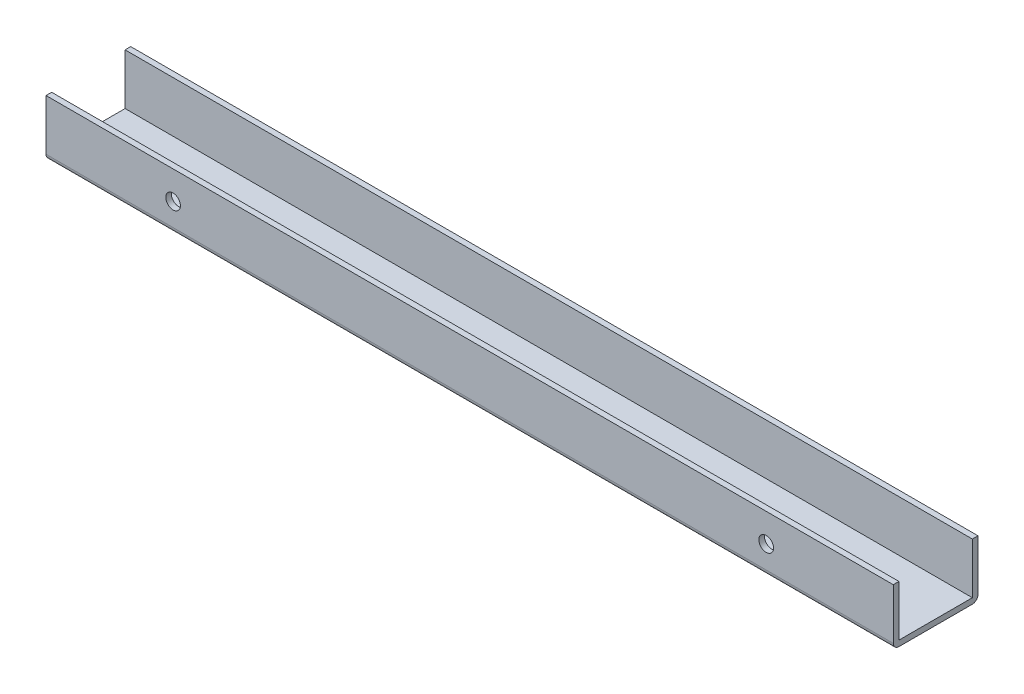
ISO-10303-21;
HEADER;
FILE_DESCRIPTION(('STEP AP214'),'2;1');
FILE_NAME('part.step','',(''),(''),'','','');
FILE_SCHEMA(('AUTOMOTIVE_DESIGN { 1 0 10303 214 1 1 1 1 }'));
ENDSEC;
DATA;
#1=APPLICATION_CONTEXT('core data for automotive mechanical design processes');
#2=APPLICATION_PROTOCOL_DEFINITION('international standard','automotive_design',2000,#1);
#3=PRODUCT_CONTEXT('',#1,'mechanical');
#4=PRODUCT('Part','Part','',(#3));
#5=PRODUCT_RELATED_PRODUCT_CATEGORY('part','',(#4));
#6=PRODUCT_DEFINITION_FORMATION('','',#4);
#7=PRODUCT_DEFINITION_CONTEXT('part definition',#1,'design');
#8=PRODUCT_DEFINITION('design','',#6,#7);
#9=PRODUCT_DEFINITION_SHAPE('','',#8);
#10=(LENGTH_UNIT() NAMED_UNIT(*) SI_UNIT(.MILLI.,.METRE.));
#11=(NAMED_UNIT(*) PLANE_ANGLE_UNIT() SI_UNIT($,.RADIAN.));
#12=(NAMED_UNIT(*) SI_UNIT($,.STERADIAN.) SOLID_ANGLE_UNIT());
#13=UNCERTAINTY_MEASURE_WITH_UNIT(LENGTH_MEASURE(1.E-05),#10,'distance_accuracy_value','');
#14=(GEOMETRIC_REPRESENTATION_CONTEXT(3) GLOBAL_UNCERTAINTY_ASSIGNED_CONTEXT((#13)) GLOBAL_UNIT_ASSIGNED_CONTEXT((#10,
#11,#12)) REPRESENTATION_CONTEXT('',''));
#15=CARTESIAN_POINT('',(0.,0.,0.));
#16=DIRECTION('',(0.,0.,1.));
#17=DIRECTION('',(1.,0.,0.));
#18=AXIS2_PLACEMENT_3D('',#15,#16,#17);
#19=CARTESIAN_POINT('',(1500.,9.99999999999998,-10.));
#20=DIRECTION('',(0.,0.,1.));
#21=DIRECTION('',(0.,-1.,0.));
#22=AXIS2_PLACEMENT_3D('',#19,#20,#21);
#23=PLANE('',#22);
#24=CARTESIAN_POINT('',(1275.,49.9999999999999,-10.));
#25=DIRECTION('',(0.,0.,1.));
#26=DIRECTION('',(1.,0.,0.));
#27=AXIS2_PLACEMENT_3D('',#24,#25,#26);
#28=CIRCLE('',#27,12.9999999999998);
#29=CARTESIAN_POINT('',(1288.,49.9999999999999,-10.));
#30=VERTEX_POINT('',#29);
#31=EDGE_CURVE('E211',#30,#30,#28,.T.);
#32=ORIENTED_EDGE('',*,*,#31,.T.);
#33=EDGE_LOOP('',(#32));
#34=FACE_BOUND('',#33,.T.);
#35=CARTESIAN_POINT('',(225.,49.9999999999999,-10.));
#36=DIRECTION('',(0.,0.,1.));
#37=DIRECTION('',(1.,0.,0.));
#38=AXIS2_PLACEMENT_3D('',#35,#36,#37);
#39=CIRCLE('',#38,13.);
#40=CARTESIAN_POINT('',(238.,49.9999999999999,-10.));
#41=VERTEX_POINT('',#40);
#42=EDGE_CURVE('E146',#41,#41,#39,.T.);
#43=ORIENTED_EDGE('',*,*,#42,.T.);
#44=EDGE_LOOP('',(#43));
#45=FACE_BOUND('',#44,.T.);
#46=DIRECTION('',(0.,1.,0.));
#47=VECTOR('',#46,1.);
#48=CARTESIAN_POINT('',(0.,10.,-10.));
#49=LINE('',#48,#47);
#50=CARTESIAN_POINT('',(0.,10.,-10.));
#51=VERTEX_POINT('',#50);
#52=CARTESIAN_POINT('',(0.,100.,-10.0000000000001));
#53=VERTEX_POINT('',#52);
#54=EDGE_CURVE('E142',#51,#53,#49,.T.);
#55=ORIENTED_EDGE('',*,*,#54,.T.);
#56=DIRECTION('',(-1.,0.,0.));
#57=VECTOR('',#56,1.);
#58=CARTESIAN_POINT('',(1500.,100.,-10.0000000000001));
#59=LINE('',#58,#57);
#60=CARTESIAN_POINT('',(1500.,100.,-10.0000000000001));
#61=VERTEX_POINT('',#60);
#62=EDGE_CURVE('E11',#61,#53,#59,.T.);
#63=ORIENTED_EDGE('',*,*,#62,.F.);
#64=DIRECTION('',(0.,1.,0.));
#65=VECTOR('',#64,1.);
#66=CARTESIAN_POINT('',(1500.,9.99999999999998,-10.));
#67=LINE('',#66,#65);
#68=CARTESIAN_POINT('',(1500.,9.99999999999998,-10.));
#69=VERTEX_POINT('',#68);
#70=EDGE_CURVE('E161',#69,#61,#67,.T.);
#71=ORIENTED_EDGE('',*,*,#70,.F.);
#72=DIRECTION('',(-1.,0.,0.));
#73=VECTOR('',#72,1.);
#74=CARTESIAN_POINT('',(1500.,9.99999999999998,-10.));
#75=LINE('',#74,#73);
#76=EDGE_CURVE('E138',#69,#51,#75,.T.);
#77=ORIENTED_EDGE('',*,*,#76,.T.);
#78=EDGE_LOOP('',(#55,#63,#71,#77));
#79=FACE_BOUND('',#78,.T.);
#80=ADVANCED_FACE('F34',(#34,#45,#79),#23,.F.);
#81=CARTESIAN_POINT('',(1500.,100.,-1.11022302462516E-13));
#82=DIRECTION('',(0.,-1.,0.));
#83=DIRECTION('',(0.,0.,-1.));
#84=AXIS2_PLACEMENT_3D('',#81,#82,#83);
#85=PLANE('',#84);
#86=DIRECTION('',(0.,0.,1.));
#87=VECTOR('',#86,1.);
#88=CARTESIAN_POINT('',(0.,100.,-1.11022302462516E-13));
#89=LINE('',#88,#87);
#90=CARTESIAN_POINT('',(0.,100.,-1.11022302462516E-13));
#91=VERTEX_POINT('',#90);
#92=EDGE_CURVE('E145',#53,#91,#89,.T.);
#93=ORIENTED_EDGE('',*,*,#92,.T.);
#94=DIRECTION('',(-1.,0.,0.));
#95=VECTOR('',#94,1.);
#96=CARTESIAN_POINT('',(1500.,100.,-1.11022302462516E-13));
#97=LINE('',#96,#95);
#98=CARTESIAN_POINT('',(1500.,100.,-1.11022302462516E-13));
#99=VERTEX_POINT('',#98);
#100=EDGE_CURVE('E42',#99,#91,#97,.T.);
#101=ORIENTED_EDGE('',*,*,#100,.F.);
#102=DIRECTION('',(0.,0.,1.));
#103=VECTOR('',#102,1.);
#104=CARTESIAN_POINT('',(1500.,100.,-1.11022302462516E-13));
#105=LINE('',#104,#103);
#106=EDGE_CURVE('E99',#61,#99,#105,.T.);
#107=ORIENTED_EDGE('',*,*,#106,.F.);
#108=ORIENTED_EDGE('',*,*,#62,.T.);
#109=EDGE_LOOP('',(#93,#101,#107,#108));
#110=FACE_BOUND('',#109,.T.);
#111=ADVANCED_FACE('F231',(#110),#85,.F.);
#112=CARTESIAN_POINT('',(1500.,10.,0.));
#113=DIRECTION('',(0.,0.,-1.));
#114=DIRECTION('',(-1.,0.,0.));
#115=AXIS2_PLACEMENT_3D('',#112,#113,#114);
#116=PLANE('',#115);
#117=CARTESIAN_POINT('',(1275.,49.9999999999999,0.));
#118=DIRECTION('',(0.,0.,1.));
#119=DIRECTION('',(1.,0.,0.));
#120=AXIS2_PLACEMENT_3D('',#117,#118,#119);
#121=CIRCLE('',#120,12.9999999999998);
#122=CARTESIAN_POINT('',(1288.,49.9999999999999,0.));
#123=VERTEX_POINT('',#122);
#124=EDGE_CURVE('E214',#123,#123,#121,.T.);
#125=ORIENTED_EDGE('',*,*,#124,.F.);
#126=EDGE_LOOP('',(#125));
#127=FACE_BOUND('',#126,.T.);
#128=CARTESIAN_POINT('',(225.,49.9999999999999,0.));
#129=DIRECTION('',(0.,0.,1.));
#130=DIRECTION('',(1.,0.,0.));
#131=AXIS2_PLACEMENT_3D('',#128,#129,#130);
#132=CIRCLE('',#131,13.);
#133=CARTESIAN_POINT('',(238.,49.9999999999999,0.));
#134=VERTEX_POINT('',#133);
#135=EDGE_CURVE('E208',#134,#134,#132,.T.);
#136=ORIENTED_EDGE('',*,*,#135,.F.);
#137=EDGE_LOOP('',(#136));
#138=FACE_BOUND('',#137,.T.);
#139=DIRECTION('',(0.,-1.,0.));
#140=VECTOR('',#139,1.);
#141=CARTESIAN_POINT('',(0.,10.0000000000001,0.));
#142=LINE('',#141,#140);
#143=CARTESIAN_POINT('',(0.,10.0000000000001,0.));
#144=VERTEX_POINT('',#143);
#145=EDGE_CURVE('E148',#91,#144,#142,.T.);
#146=ORIENTED_EDGE('',*,*,#145,.T.);
#147=DIRECTION('',(-1.,0.,0.));
#148=VECTOR('',#147,1.);
#149=CARTESIAN_POINT('',(1500.,10.,0.));
#150=LINE('',#149,#148);
#151=CARTESIAN_POINT('',(1500.,10.,0.));
#152=VERTEX_POINT('',#151);
#153=EDGE_CURVE('E174',#152,#144,#150,.T.);
#154=ORIENTED_EDGE('',*,*,#153,.F.);
#155=DIRECTION('',(0.,-1.,0.));
#156=VECTOR('',#155,1.);
#157=CARTESIAN_POINT('',(1500.,10.,0.));
#158=LINE('',#157,#156);
#159=EDGE_CURVE('E182',#99,#152,#158,.T.);
#160=ORIENTED_EDGE('',*,*,#159,.F.);
#161=ORIENTED_EDGE('',*,*,#100,.T.);
#162=EDGE_LOOP('',(#146,#154,#160,#161));
#163=FACE_BOUND('',#162,.T.);
#164=ADVANCED_FACE('F180',(#127,#138,#163),#116,.F.);
#165=CARTESIAN_POINT('',(1500.,9.99999999999998,-10.));
#166=DIRECTION('',(-1.,0.,0.));
#167=DIRECTION('',(0.,0.,1.));
#168=AXIS2_PLACEMENT_3D('',#165,#166,#167);
#169=CYLINDRICAL_SURFACE('',#168,10.);
#170=CARTESIAN_POINT('',(0.,10.,-10.));
#171=DIRECTION('',(1.,0.,0.));
#172=DIRECTION('',(0.,0.,1.));
#173=AXIS2_PLACEMENT_3D('',#170,#171,#172);
#174=CIRCLE('',#173,10.);
#175=CARTESIAN_POINT('',(0.,0.,-10.0000000000001));
#176=VERTEX_POINT('',#175);
#177=EDGE_CURVE('E150',#144,#176,#174,.T.);
#178=ORIENTED_EDGE('',*,*,#177,.T.);
#179=DIRECTION('',(-1.,0.,0.));
#180=VECTOR('',#179,1.);
#181=CARTESIAN_POINT('',(1500.,-1.11022302462516E-13,-10.0000000000001));
#182=LINE('',#181,#180);
#183=CARTESIAN_POINT('',(1500.,-1.11022302462516E-13,-10.0000000000001));
#184=VERTEX_POINT('',#183);
#185=EDGE_CURVE('E171',#184,#176,#182,.T.);
#186=ORIENTED_EDGE('',*,*,#185,.F.);
#187=CARTESIAN_POINT('',(1500.,9.99999999999998,-10.));
#188=DIRECTION('',(1.,0.,0.));
#189=DIRECTION('',(0.,0.,1.));
#190=AXIS2_PLACEMENT_3D('',#187,#188,#189);
#191=CIRCLE('',#190,10.);
#192=EDGE_CURVE('E200',#152,#184,#191,.T.);
#193=ORIENTED_EDGE('',*,*,#192,.F.);
#194=ORIENTED_EDGE('',*,*,#153,.T.);
#195=EDGE_LOOP('',(#178,#186,#193,#194));
#196=FACE_BOUND('',#195,.T.);
#197=ADVANCED_FACE('F191',(#196),#169,.T.);
#198=CARTESIAN_POINT('',(1500.,-1.11022302462516E-13,-10.0000000000001));
#199=DIRECTION('',(0.,1.,0.));
#200=DIRECTION('',(0.,0.,1.));
#201=AXIS2_PLACEMENT_3D('',#198,#199,#200);
#202=PLANE('',#201);
#203=DIRECTION('',(0.,0.,-1.));
#204=VECTOR('',#203,1.);
#205=CARTESIAN_POINT('',(0.,0.,-10.0000000000001));
#206=LINE('',#205,#204);
#207=CARTESIAN_POINT('',(0.,-1.11022302462516E-13,-140.));
#208=VERTEX_POINT('',#207);
#209=EDGE_CURVE('E152',#176,#208,#206,.T.);
#210=ORIENTED_EDGE('',*,*,#209,.T.);
#211=DIRECTION('',(-1.,0.,0.));
#212=VECTOR('',#211,1.);
#213=CARTESIAN_POINT('',(1500.,0.,-140.));
#214=LINE('',#213,#212);
#215=CARTESIAN_POINT('',(1500.,0.,-140.));
#216=VERTEX_POINT('',#215);
#217=EDGE_CURVE('E168',#216,#208,#214,.T.);
#218=ORIENTED_EDGE('',*,*,#217,.F.);
#219=DIRECTION('',(0.,0.,-1.));
#220=VECTOR('',#219,1.);
#221=CARTESIAN_POINT('',(1500.,-1.11022302462516E-13,-10.0000000000001));
#222=LINE('',#221,#220);
#223=EDGE_CURVE('E197',#184,#216,#222,.T.);
#224=ORIENTED_EDGE('',*,*,#223,.F.);
#225=ORIENTED_EDGE('',*,*,#185,.T.);
#226=EDGE_LOOP('',(#210,#218,#224,#225));
#227=FACE_BOUND('',#226,.T.);
#228=ADVANCED_FACE('F195',(#227),#202,.F.);
#229=CARTESIAN_POINT('',(1500.,9.99999999999998,-140.));
#230=DIRECTION('',(-1.,0.,0.));
#231=DIRECTION('',(0.,0.,1.));
#232=AXIS2_PLACEMENT_3D('',#229,#230,#231);
#233=CYLINDRICAL_SURFACE('',#232,10.);
#234=CARTESIAN_POINT('',(0.,9.9999999999999,-140.));
#235=DIRECTION('',(1.,0.,0.));
#236=DIRECTION('',(0.,0.,-1.));
#237=AXIS2_PLACEMENT_3D('',#234,#235,#236);
#238=CIRCLE('',#237,10.);
#239=CARTESIAN_POINT('',(0.,9.99999999999998,-150.));
#240=VERTEX_POINT('',#239);
#241=EDGE_CURVE('E154',#208,#240,#238,.T.);
#242=ORIENTED_EDGE('',*,*,#241,.T.);
#243=DIRECTION('',(-1.,0.,0.));
#244=VECTOR('',#243,1.);
#245=CARTESIAN_POINT('',(1500.,10.0000000000001,-150.));
#246=LINE('',#245,#244);
#247=CARTESIAN_POINT('',(1500.,10.0000000000001,-150.));
#248=VERTEX_POINT('',#247);
#249=EDGE_CURVE('E165',#248,#240,#246,.T.);
#250=ORIENTED_EDGE('',*,*,#249,.F.);
#251=CARTESIAN_POINT('',(1500.,9.99999999999998,-140.));
#252=DIRECTION('',(1.,0.,0.));
#253=DIRECTION('',(0.,0.,-1.));
#254=AXIS2_PLACEMENT_3D('',#251,#252,#253);
#255=CIRCLE('',#254,10.);
#256=EDGE_CURVE('E199',#216,#248,#255,.T.);
#257=ORIENTED_EDGE('',*,*,#256,.F.);
#258=ORIENTED_EDGE('',*,*,#217,.T.);
#259=EDGE_LOOP('',(#242,#250,#257,#258));
#260=FACE_BOUND('',#259,.T.);
#261=ADVANCED_FACE('F255',(#260),#233,.T.);
#262=CARTESIAN_POINT('',(1500.,10.0000000000001,-150.));
#263=DIRECTION('',(0.,0.,1.));
#264=DIRECTION('',(1.,0.,0.));
#265=AXIS2_PLACEMENT_3D('',#262,#263,#264);
#266=PLANE('',#265);
#267=DIRECTION('',(0.,1.,0.));
#268=VECTOR('',#267,1.);
#269=CARTESIAN_POINT('',(0.,9.99999999999998,-150.));
#270=LINE('',#269,#268);
#271=CARTESIAN_POINT('',(0.,100.,-150.));
#272=VERTEX_POINT('',#271);
#273=EDGE_CURVE('E156',#240,#272,#270,.T.);
#274=ORIENTED_EDGE('',*,*,#273,.T.);
#275=DIRECTION('',(-1.,0.,0.));
#276=VECTOR('',#275,1.);
#277=CARTESIAN_POINT('',(1500.,99.9999999999999,-150.));
#278=LINE('',#277,#276);
#279=CARTESIAN_POINT('',(1500.,99.9999999999999,-150.));
#280=VERTEX_POINT('',#279);
#281=EDGE_CURVE('E133',#280,#272,#278,.T.);
#282=ORIENTED_EDGE('',*,*,#281,.F.);
#283=DIRECTION('',(0.,1.,0.));
#284=VECTOR('',#283,1.);
#285=CARTESIAN_POINT('',(1500.,10.0000000000001,-150.));
#286=LINE('',#285,#284);
#287=EDGE_CURVE('E124',#248,#280,#286,.T.);
#288=ORIENTED_EDGE('',*,*,#287,.F.);
#289=ORIENTED_EDGE('',*,*,#249,.T.);
#290=EDGE_LOOP('',(#274,#282,#288,#289));
#291=FACE_BOUND('',#290,.T.);
#292=ADVANCED_FACE('F258',(#291),#266,.F.);
#293=CARTESIAN_POINT('',(1500.,99.9999999999999,-140.));
#294=DIRECTION('',(0.,-1.,0.));
#295=DIRECTION('',(0.,0.,-1.));
#296=AXIS2_PLACEMENT_3D('',#293,#294,#295);
#297=PLANE('',#296);
#298=DIRECTION('',(0.,0.,1.));
#299=VECTOR('',#298,1.);
#300=CARTESIAN_POINT('',(0.,100.,-140.));
#301=LINE('',#300,#299);
#302=CARTESIAN_POINT('',(0.,100.,-140.));
#303=VERTEX_POINT('',#302);
#304=EDGE_CURVE('E132',#272,#303,#301,.T.);
#305=ORIENTED_EDGE('',*,*,#304,.T.);
#306=DIRECTION('',(-1.,0.,0.));
#307=VECTOR('',#306,1.);
#308=CARTESIAN_POINT('',(1500.,99.9999999999999,-140.));
#309=LINE('',#308,#307);
#310=CARTESIAN_POINT('',(1500.,99.9999999999999,-140.));
#311=VERTEX_POINT('',#310);
#312=EDGE_CURVE('E129',#311,#303,#309,.T.);
#313=ORIENTED_EDGE('',*,*,#312,.F.);
#314=DIRECTION('',(0.,0.,1.));
#315=VECTOR('',#314,1.);
#316=CARTESIAN_POINT('',(1500.,99.9999999999999,-140.));
#317=LINE('',#316,#315);
#318=EDGE_CURVE('E118',#280,#311,#317,.T.);
#319=ORIENTED_EDGE('',*,*,#318,.F.);
#320=ORIENTED_EDGE('',*,*,#281,.T.);
#321=EDGE_LOOP('',(#305,#313,#319,#320));
#322=FACE_BOUND('',#321,.T.);
#323=ADVANCED_FACE('F130',(#322),#297,.F.);
#324=CARTESIAN_POINT('',(1500.,9.99999999999998,-140.));
#325=DIRECTION('',(0.,0.,-1.));
#326=DIRECTION('',(-1.,0.,0.));
#327=AXIS2_PLACEMENT_3D('',#324,#325,#326);
#328=PLANE('',#327);
#329=DIRECTION('',(0.,-1.,0.));
#330=VECTOR('',#329,1.);
#331=CARTESIAN_POINT('',(0.,9.9999999999999,-140.));
#332=LINE('',#331,#330);
#333=CARTESIAN_POINT('',(0.,9.9999999999999,-140.));
#334=VERTEX_POINT('',#333);
#335=EDGE_CURVE('E85',#303,#334,#332,.T.);
#336=ORIENTED_EDGE('',*,*,#335,.T.);
#337=DIRECTION('',(-1.,0.,0.));
#338=VECTOR('',#337,1.);
#339=CARTESIAN_POINT('',(1500.,9.99999999999998,-140.));
#340=LINE('',#339,#338);
#341=CARTESIAN_POINT('',(1500.,9.99999999999998,-140.));
#342=VERTEX_POINT('',#341);
#343=EDGE_CURVE('E134',#342,#334,#340,.T.);
#344=ORIENTED_EDGE('',*,*,#343,.F.);
#345=DIRECTION('',(0.,-1.,0.));
#346=VECTOR('',#345,1.);
#347=CARTESIAN_POINT('',(1500.,9.99999999999998,-140.));
#348=LINE('',#347,#346);
#349=EDGE_CURVE('E122',#311,#342,#348,.T.);
#350=ORIENTED_EDGE('',*,*,#349,.F.);
#351=ORIENTED_EDGE('',*,*,#312,.T.);
#352=EDGE_LOOP('',(#336,#344,#350,#351));
#353=FACE_BOUND('',#352,.T.);
#354=ADVANCED_FACE('F136',(#353),#328,.F.);
#355=CARTESIAN_POINT('',(1500.,9.99999999999998,-10.));
#356=DIRECTION('',(0.,-1.,0.));
#357=DIRECTION('',(0.,0.,-1.));
#358=AXIS2_PLACEMENT_3D('',#355,#356,#357);
#359=PLANE('',#358);
#360=DIRECTION('',(0.,0.,1.));
#361=VECTOR('',#360,1.);
#362=CARTESIAN_POINT('',(0.,10.,-10.));
#363=LINE('',#362,#361);
#364=EDGE_CURVE('E91',#334,#51,#363,.T.);
#365=ORIENTED_EDGE('',*,*,#364,.T.);
#366=ORIENTED_EDGE('',*,*,#76,.F.);
#367=DIRECTION('',(0.,0.,1.));
#368=VECTOR('',#367,1.);
#369=CARTESIAN_POINT('',(1500.,9.99999999999998,-10.));
#370=LINE('',#369,#368);
#371=EDGE_CURVE('E50',#342,#69,#370,.T.);
#372=ORIENTED_EDGE('',*,*,#371,.F.);
#373=ORIENTED_EDGE('',*,*,#343,.T.);
#374=EDGE_LOOP('',(#365,#366,#372,#373));
#375=FACE_BOUND('',#374,.T.);
#376=ADVANCED_FACE('F267',(#375),#359,.F.);
#377=CARTESIAN_POINT('',(1500.,9.99999999999998,-10.));
#378=DIRECTION('',(-1.,0.,0.));
#379=DIRECTION('',(0.,0.,1.));
#380=AXIS2_PLACEMENT_3D('',#377,#378,#379);
#381=PLANE('',#380);
#382=ORIENTED_EDGE('',*,*,#70,.T.);
#383=ORIENTED_EDGE('',*,*,#106,.T.);
#384=ORIENTED_EDGE('',*,*,#159,.T.);
#385=ORIENTED_EDGE('',*,*,#192,.T.);
#386=ORIENTED_EDGE('',*,*,#223,.T.);
#387=ORIENTED_EDGE('',*,*,#256,.T.);
#388=ORIENTED_EDGE('',*,*,#287,.T.);
#389=ORIENTED_EDGE('',*,*,#318,.T.);
#390=ORIENTED_EDGE('',*,*,#349,.T.);
#391=ORIENTED_EDGE('',*,*,#371,.T.);
#392=EDGE_LOOP('',(#382,#383,#384,#385,#386,#387,#388,#389,#390,#391));
#393=FACE_BOUND('',#392,.T.);
#394=ADVANCED_FACE('F120',(#393),#381,.F.);
#395=CARTESIAN_POINT('',(0.,10.,-10.));
#396=DIRECTION('',(-1.,0.,0.));
#397=DIRECTION('',(0.,0.,1.));
#398=AXIS2_PLACEMENT_3D('',#395,#396,#397);
#399=PLANE('',#398);
#400=ORIENTED_EDGE('',*,*,#54,.F.);
#401=ORIENTED_EDGE('',*,*,#364,.F.);
#402=ORIENTED_EDGE('',*,*,#335,.F.);
#403=ORIENTED_EDGE('',*,*,#304,.F.);
#404=ORIENTED_EDGE('',*,*,#273,.F.);
#405=ORIENTED_EDGE('',*,*,#241,.F.);
#406=ORIENTED_EDGE('',*,*,#209,.F.);
#407=ORIENTED_EDGE('',*,*,#177,.F.);
#408=ORIENTED_EDGE('',*,*,#145,.F.);
#409=ORIENTED_EDGE('',*,*,#92,.F.);
#410=EDGE_LOOP('',(#400,#401,#402,#403,#404,#405,#406,#407,#408,#409));
#411=FACE_BOUND('',#410,.T.);
#412=ADVANCED_FACE('F186',(#411),#399,.T.);
#413=CARTESIAN_POINT('',(225.,49.9999999999999,-10.));
#414=DIRECTION('',(0.,0.,1.));
#415=DIRECTION('',(1.,0.,0.));
#416=AXIS2_PLACEMENT_3D('',#413,#414,#415);
#417=CYLINDRICAL_SURFACE('',#416,13.);
#418=ORIENTED_EDGE('',*,*,#42,.F.);
#419=EDGE_LOOP('',(#418));
#420=FACE_BOUND('',#419,.T.);
#421=ORIENTED_EDGE('',*,*,#135,.T.);
#422=EDGE_LOOP('',(#421));
#423=FACE_BOUND('',#422,.T.);
#424=ADVANCED_FACE('F225',(#420,#423),#417,.F.);
#425=CARTESIAN_POINT('',(1275.,49.9999999999999,-10.));
#426=DIRECTION('',(0.,0.,1.));
#427=DIRECTION('',(1.,0.,0.));
#428=AXIS2_PLACEMENT_3D('',#425,#426,#427);
#429=CYLINDRICAL_SURFACE('',#428,12.9999999999998);
#430=ORIENTED_EDGE('',*,*,#31,.F.);
#431=EDGE_LOOP('',(#430));
#432=FACE_BOUND('',#431,.T.);
#433=ORIENTED_EDGE('',*,*,#124,.T.);
#434=EDGE_LOOP('',(#433));
#435=FACE_BOUND('',#434,.T.);
#436=ADVANCED_FACE('F222',(#432,#435),#429,.F.);
#437=CLOSED_SHELL('',(#80,#111,#164,#197,#228,#261,#292,#323,#354,#376,#394,#412,#424,#436));
#438=MANIFOLD_SOLID_BREP('B2',#437);
#439=ADVANCED_BREP_SHAPE_REPRESENTATION('',(#18,#438),#14);
#440=SHAPE_DEFINITION_REPRESENTATION(#9,#439);
ENDSEC;
END-ISO-10303-21;
